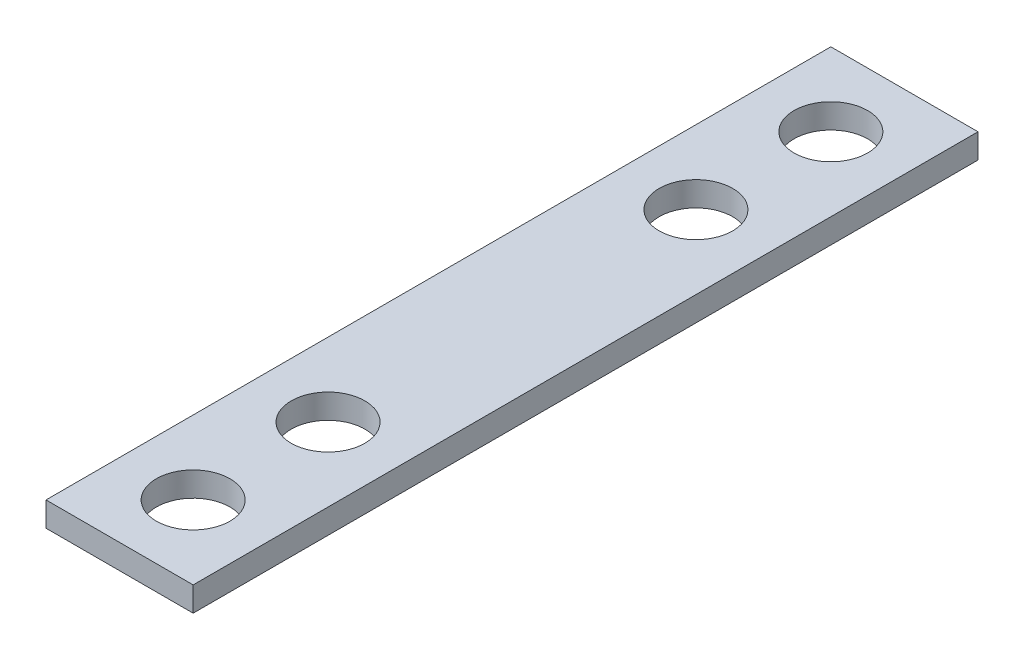
ISO-10303-21;
HEADER;
FILE_DESCRIPTION(('STEP AP214'),'2;1');
FILE_NAME('part.step','',(''),(''),'','','');
FILE_SCHEMA(('AUTOMOTIVE_DESIGN { 1 0 10303 214 1 1 1 1 }'));
ENDSEC;
DATA;
#1=APPLICATION_CONTEXT('core data for automotive mechanical design processes');
#2=APPLICATION_PROTOCOL_DEFINITION('international standard','automotive_design',2000,#1);
#3=PRODUCT_CONTEXT('',#1,'mechanical');
#4=PRODUCT('Part','Part','',(#3));
#5=PRODUCT_RELATED_PRODUCT_CATEGORY('part','',(#4));
#6=PRODUCT_DEFINITION_FORMATION('','',#4);
#7=PRODUCT_DEFINITION_CONTEXT('part definition',#1,'design');
#8=PRODUCT_DEFINITION('design','',#6,#7);
#9=PRODUCT_DEFINITION_SHAPE('','',#8);
#10=(LENGTH_UNIT() NAMED_UNIT(*) SI_UNIT(.MILLI.,.METRE.));
#11=(NAMED_UNIT(*) PLANE_ANGLE_UNIT() SI_UNIT($,.RADIAN.));
#12=(NAMED_UNIT(*) SI_UNIT($,.STERADIAN.) SOLID_ANGLE_UNIT());
#13=UNCERTAINTY_MEASURE_WITH_UNIT(LENGTH_MEASURE(1.E-05),#10,'distance_accuracy_value','');
#14=(GEOMETRIC_REPRESENTATION_CONTEXT(3) GLOBAL_UNCERTAINTY_ASSIGNED_CONTEXT((#13)) GLOBAL_UNIT_ASSIGNED_CONTEXT((#10,
#11,#12)) REPRESENTATION_CONTEXT('',''));
#15=CARTESIAN_POINT('',(0.,0.,0.));
#16=DIRECTION('',(0.,0.,1.));
#17=DIRECTION('',(1.,0.,0.));
#18=AXIS2_PLACEMENT_3D('',#15,#16,#17);
#19=CARTESIAN_POINT('',(-9.,1.,13.));
#20=DIRECTION('',(0.,-1.,0.));
#21=DIRECTION('',(0.,0.,-1.));
#22=AXIS2_PLACEMENT_3D('',#19,#20,#21);
#23=CYLINDRICAL_SURFACE('',#22,1.5);
#24=CARTESIAN_POINT('',(-9.,2.,13.));
#25=DIRECTION('',(0.,1.,0.));
#26=DIRECTION('',(0.,0.,1.));
#27=AXIS2_PLACEMENT_3D('',#24,#25,#26);
#28=CIRCLE('',#27,1.5);
#29=CARTESIAN_POINT('',(-9.,2.,14.5));
#30=VERTEX_POINT('',#29);
#31=EDGE_CURVE('E123',#30,#30,#28,.T.);
#32=ORIENTED_EDGE('',*,*,#31,.T.);
#33=EDGE_LOOP('',(#32));
#34=FACE_BOUND('',#33,.T.);
#35=CARTESIAN_POINT('',(-9.,1.,13.));
#36=DIRECTION('',(0.,-1.,0.));
#37=DIRECTION('',(0.,0.,-1.));
#38=AXIS2_PLACEMENT_3D('',#35,#36,#37);
#39=CIRCLE('',#38,1.5);
#40=CARTESIAN_POINT('',(-9.,1.,11.5));
#41=VERTEX_POINT('',#40);
#42=EDGE_CURVE('E144',#41,#41,#39,.T.);
#43=ORIENTED_EDGE('',*,*,#42,.T.);
#44=EDGE_LOOP('',(#43));
#45=FACE_BOUND('',#44,.T.);
#46=ADVANCED_FACE('F41',(#34,#45),#23,.F.);
#47=CARTESIAN_POINT('',(-9.,1.,-13.));
#48=DIRECTION('',(0.,-1.,0.));
#49=DIRECTION('',(0.,0.,-1.));
#50=AXIS2_PLACEMENT_3D('',#47,#48,#49);
#51=CYLINDRICAL_SURFACE('',#50,1.5);
#52=CARTESIAN_POINT('',(-9.,2.,-13.));
#53=DIRECTION('',(0.,1.,0.));
#54=DIRECTION('',(0.,0.,1.));
#55=AXIS2_PLACEMENT_3D('',#52,#53,#54);
#56=CIRCLE('',#55,1.5);
#57=CARTESIAN_POINT('',(-9.,2.,-11.5));
#58=VERTEX_POINT('',#57);
#59=EDGE_CURVE('E127',#58,#58,#56,.T.);
#60=ORIENTED_EDGE('',*,*,#59,.T.);
#61=EDGE_LOOP('',(#60));
#62=FACE_BOUND('',#61,.T.);
#63=CARTESIAN_POINT('',(-9.,1.,-13.));
#64=DIRECTION('',(0.,-1.,0.));
#65=DIRECTION('',(0.,0.,-1.));
#66=AXIS2_PLACEMENT_3D('',#63,#64,#65);
#67=CIRCLE('',#66,1.5);
#68=CARTESIAN_POINT('',(-9.,1.,-14.5));
#69=VERTEX_POINT('',#68);
#70=EDGE_CURVE('E151',#69,#69,#67,.T.);
#71=ORIENTED_EDGE('',*,*,#70,.T.);
#72=EDGE_LOOP('',(#71));
#73=FACE_BOUND('',#72,.T.);
#74=ADVANCED_FACE('F190',(#62,#73),#51,.F.);
#75=CARTESIAN_POINT('',(0.,1.,-16.));
#76=DIRECTION('',(0.,0.,-1.));
#77=DIRECTION('',(-1.,0.,0.));
#78=AXIS2_PLACEMENT_3D('',#75,#76,#77);
#79=PLANE('',#78);
#80=DIRECTION('',(0.,-1.,0.));
#81=VECTOR('',#80,1.);
#82=CARTESIAN_POINT('',(-5.99999999999999,2.,-16.));
#83=LINE('',#82,#81);
#84=CARTESIAN_POINT('',(-5.99999999999999,2.,-16.));
#85=VERTEX_POINT('',#84);
#86=CARTESIAN_POINT('',(-5.99999999999999,1.,-16.));
#87=VERTEX_POINT('',#86);
#88=EDGE_CURVE('E104',#85,#87,#83,.T.);
#89=ORIENTED_EDGE('',*,*,#88,.T.);
#90=DIRECTION('',(-1.,0.,0.));
#91=VECTOR('',#90,1.);
#92=CARTESIAN_POINT('',(0.,1.,-16.));
#93=LINE('',#92,#91);
#94=CARTESIAN_POINT('',(-12.,1.,-16.));
#95=VERTEX_POINT('',#94);
#96=EDGE_CURVE('E86',#87,#95,#93,.T.);
#97=ORIENTED_EDGE('',*,*,#96,.T.);
#98=DIRECTION('',(0.,-1.,0.));
#99=VECTOR('',#98,1.);
#100=CARTESIAN_POINT('',(-12.,2.,-16.));
#101=LINE('',#100,#99);
#102=CARTESIAN_POINT('',(-12.,2.,-16.));
#103=VERTEX_POINT('',#102);
#104=EDGE_CURVE('E107',#103,#95,#101,.T.);
#105=ORIENTED_EDGE('',*,*,#104,.F.);
#106=DIRECTION('',(-1.,0.,0.));
#107=VECTOR('',#106,1.);
#108=CARTESIAN_POINT('',(-12.,2.,-16.));
#109=LINE('',#108,#107);
#110=EDGE_CURVE('E60',#85,#103,#109,.T.);
#111=ORIENTED_EDGE('',*,*,#110,.F.);
#112=EDGE_LOOP('',(#89,#97,#105,#111));
#113=FACE_BOUND('',#112,.T.);
#114=ADVANCED_FACE('F157',(#113),#79,.T.);
#115=CARTESIAN_POINT('',(0.,1.,16.));
#116=DIRECTION('',(0.,0.,-1.));
#117=DIRECTION('',(-1.,0.,0.));
#118=AXIS2_PLACEMENT_3D('',#115,#116,#117);
#119=PLANE('',#118);
#120=DIRECTION('',(-1.,0.,0.));
#121=VECTOR('',#120,1.);
#122=CARTESIAN_POINT('',(0.,1.,16.));
#123=LINE('',#122,#121);
#124=CARTESIAN_POINT('',(-5.99999999999999,1.,16.));
#125=VERTEX_POINT('',#124);
#126=CARTESIAN_POINT('',(-12.,1.,16.));
#127=VERTEX_POINT('',#126);
#128=EDGE_CURVE('E84',#125,#127,#123,.T.);
#129=ORIENTED_EDGE('',*,*,#128,.F.);
#130=DIRECTION('',(0.,-1.,0.));
#131=VECTOR('',#130,1.);
#132=CARTESIAN_POINT('',(-5.99999999999999,2.,16.));
#133=LINE('',#132,#131);
#134=CARTESIAN_POINT('',(-5.99999999999999,2.,16.));
#135=VERTEX_POINT('',#134);
#136=EDGE_CURVE('E96',#135,#125,#133,.T.);
#137=ORIENTED_EDGE('',*,*,#136,.F.);
#138=DIRECTION('',(1.,0.,0.));
#139=VECTOR('',#138,1.);
#140=CARTESIAN_POINT('',(-12.,2.,16.));
#141=LINE('',#140,#139);
#142=CARTESIAN_POINT('',(-12.,2.,16.));
#143=VERTEX_POINT('',#142);
#144=EDGE_CURVE('E117',#143,#135,#141,.T.);
#145=ORIENTED_EDGE('',*,*,#144,.F.);
#146=DIRECTION('',(0.,-1.,0.));
#147=VECTOR('',#146,1.);
#148=CARTESIAN_POINT('',(-12.,2.,16.));
#149=LINE('',#148,#147);
#150=EDGE_CURVE('E45',#143,#127,#149,.T.);
#151=ORIENTED_EDGE('',*,*,#150,.T.);
#152=EDGE_LOOP('',(#129,#137,#145,#151));
#153=FACE_BOUND('',#152,.T.);
#154=ADVANCED_FACE('F43',(#153),#119,.F.);
#155=CARTESIAN_POINT('',(0.,1.,0.));
#156=DIRECTION('',(0.,1.,0.));
#157=DIRECTION('',(0.,0.,1.));
#158=AXIS2_PLACEMENT_3D('',#155,#156,#157);
#159=PLANE('',#158);
#160=CARTESIAN_POINT('',(-9.,1.,-7.5));
#161=DIRECTION('',(0.,1.,0.));
#162=DIRECTION('',(0.,0.,1.));
#163=AXIS2_PLACEMENT_3D('',#160,#161,#162);
#164=CIRCLE('',#163,1.5);
#165=CARTESIAN_POINT('',(-9.,1.,-6.));
#166=VERTEX_POINT('',#165);
#167=EDGE_CURVE('E140',#166,#166,#164,.T.);
#168=ORIENTED_EDGE('',*,*,#167,.T.);
#169=EDGE_LOOP('',(#168));
#170=FACE_BOUND('',#169,.T.);
#171=CARTESIAN_POINT('',(-9.,1.,7.5));
#172=DIRECTION('',(0.,1.,0.));
#173=DIRECTION('',(0.,0.,1.));
#174=AXIS2_PLACEMENT_3D('',#171,#172,#173);
#175=CIRCLE('',#174,1.5);
#176=CARTESIAN_POINT('',(-9.,1.,9.));
#177=VERTEX_POINT('',#176);
#178=EDGE_CURVE('E132',#177,#177,#175,.T.);
#179=ORIENTED_EDGE('',*,*,#178,.T.);
#180=EDGE_LOOP('',(#179));
#181=FACE_BOUND('',#180,.T.);
#182=DIRECTION('',(0.,0.,1.));
#183=VECTOR('',#182,1.);
#184=CARTESIAN_POINT('',(-12.,1.,-16.));
#185=LINE('',#184,#183);
#186=EDGE_CURVE('E11',#95,#127,#185,.T.);
#187=ORIENTED_EDGE('',*,*,#186,.F.);
#188=ORIENTED_EDGE('',*,*,#96,.F.);
#189=DIRECTION('',(0.,0.,-1.));
#190=VECTOR('',#189,1.);
#191=CARTESIAN_POINT('',(-5.99999999999999,1.,16.));
#192=LINE('',#191,#190);
#193=EDGE_CURVE('E52',#125,#87,#192,.T.);
#194=ORIENTED_EDGE('',*,*,#193,.F.);
#195=ORIENTED_EDGE('',*,*,#128,.T.);
#196=EDGE_LOOP('',(#187,#188,#194,#195));
#197=FACE_BOUND('',#196,.T.);
#198=ORIENTED_EDGE('',*,*,#42,.F.);
#199=EDGE_LOOP('',(#198));
#200=FACE_BOUND('',#199,.T.);
#201=ORIENTED_EDGE('',*,*,#70,.F.);
#202=EDGE_LOOP('',(#201));
#203=FACE_BOUND('',#202,.T.);
#204=ADVANCED_FACE('F82',(#170,#181,#197,#200,#203),#159,.F.);
#205=CARTESIAN_POINT('',(0.,2.,0.));
#206=DIRECTION('',(0.,1.,0.));
#207=DIRECTION('',(0.,0.,1.));
#208=AXIS2_PLACEMENT_3D('',#205,#206,#207);
#209=PLANE('',#208);
#210=CARTESIAN_POINT('',(-9.,2.,7.5));
#211=DIRECTION('',(0.,1.,0.));
#212=DIRECTION('',(0.,0.,1.));
#213=AXIS2_PLACEMENT_3D('',#210,#211,#212);
#214=CIRCLE('',#213,1.5);
#215=CARTESIAN_POINT('',(-9.,2.,9.));
#216=VERTEX_POINT('',#215);
#217=EDGE_CURVE('E131',#216,#216,#214,.T.);
#218=ORIENTED_EDGE('',*,*,#217,.F.);
#219=EDGE_LOOP('',(#218));
#220=FACE_BOUND('',#219,.T.);
#221=ORIENTED_EDGE('',*,*,#31,.F.);
#222=EDGE_LOOP('',(#221));
#223=FACE_BOUND('',#222,.T.);
#224=DIRECTION('',(0.,0.,1.));
#225=VECTOR('',#224,1.);
#226=CARTESIAN_POINT('',(-12.,2.,-16.));
#227=LINE('',#226,#225);
#228=EDGE_CURVE('E120',#103,#143,#227,.T.);
#229=ORIENTED_EDGE('',*,*,#228,.T.);
#230=ORIENTED_EDGE('',*,*,#144,.T.);
#231=DIRECTION('',(0.,0.,-1.));
#232=VECTOR('',#231,1.);
#233=CARTESIAN_POINT('',(-5.99999999999999,2.,16.));
#234=LINE('',#233,#232);
#235=EDGE_CURVE('E102',#135,#85,#234,.T.);
#236=ORIENTED_EDGE('',*,*,#235,.T.);
#237=ORIENTED_EDGE('',*,*,#110,.T.);
#238=EDGE_LOOP('',(#229,#230,#236,#237));
#239=FACE_BOUND('',#238,.T.);
#240=ORIENTED_EDGE('',*,*,#59,.F.);
#241=EDGE_LOOP('',(#240));
#242=FACE_BOUND('',#241,.T.);
#243=CARTESIAN_POINT('',(-9.,2.,-7.5));
#244=DIRECTION('',(0.,1.,0.));
#245=DIRECTION('',(0.,0.,1.));
#246=AXIS2_PLACEMENT_3D('',#243,#244,#245);
#247=CIRCLE('',#246,1.5);
#248=CARTESIAN_POINT('',(-9.,2.,-6.));
#249=VERTEX_POINT('',#248);
#250=EDGE_CURVE('E136',#249,#249,#247,.T.);
#251=ORIENTED_EDGE('',*,*,#250,.F.);
#252=EDGE_LOOP('',(#251));
#253=FACE_BOUND('',#252,.T.);
#254=ADVANCED_FACE('F161',(#220,#223,#239,#242,#253),#209,.T.);
#255=CARTESIAN_POINT('',(-12.,2.,-16.));
#256=DIRECTION('',(1.,0.,0.));
#257=DIRECTION('',(0.,0.,-1.));
#258=AXIS2_PLACEMENT_3D('',#255,#256,#257);
#259=PLANE('',#258);
#260=ORIENTED_EDGE('',*,*,#104,.T.);
#261=ORIENTED_EDGE('',*,*,#186,.T.);
#262=ORIENTED_EDGE('',*,*,#150,.F.);
#263=ORIENTED_EDGE('',*,*,#228,.F.);
#264=EDGE_LOOP('',(#260,#261,#262,#263));
#265=FACE_BOUND('',#264,.T.);
#266=ADVANCED_FACE('F160',(#265),#259,.F.);
#267=CARTESIAN_POINT('',(-5.99999999999999,2.,16.));
#268=DIRECTION('',(-1.,0.,0.));
#269=DIRECTION('',(0.,0.,1.));
#270=AXIS2_PLACEMENT_3D('',#267,#268,#269);
#271=PLANE('',#270);
#272=ORIENTED_EDGE('',*,*,#136,.T.);
#273=ORIENTED_EDGE('',*,*,#193,.T.);
#274=ORIENTED_EDGE('',*,*,#88,.F.);
#275=ORIENTED_EDGE('',*,*,#235,.F.);
#276=EDGE_LOOP('',(#272,#273,#274,#275));
#277=FACE_BOUND('',#276,.T.);
#278=ADVANCED_FACE('F101',(#277),#271,.F.);
#279=CARTESIAN_POINT('',(-9.,2.,7.5));
#280=DIRECTION('',(0.,-1.,0.));
#281=DIRECTION('',(0.,0.,-1.));
#282=AXIS2_PLACEMENT_3D('',#279,#280,#281);
#283=CYLINDRICAL_SURFACE('',#282,1.5);
#284=ORIENTED_EDGE('',*,*,#217,.T.);
#285=EDGE_LOOP('',(#284));
#286=FACE_BOUND('',#285,.T.);
#287=ORIENTED_EDGE('',*,*,#178,.F.);
#288=EDGE_LOOP('',(#287));
#289=FACE_BOUND('',#288,.T.);
#290=ADVANCED_FACE('F173',(#286,#289),#283,.F.);
#291=CARTESIAN_POINT('',(-9.,2.,-7.5));
#292=DIRECTION('',(0.,-1.,0.));
#293=DIRECTION('',(0.,0.,-1.));
#294=AXIS2_PLACEMENT_3D('',#291,#292,#293);
#295=CYLINDRICAL_SURFACE('',#294,1.5);
#296=ORIENTED_EDGE('',*,*,#250,.T.);
#297=EDGE_LOOP('',(#296));
#298=FACE_BOUND('',#297,.T.);
#299=ORIENTED_EDGE('',*,*,#167,.F.);
#300=EDGE_LOOP('',(#299));
#301=FACE_BOUND('',#300,.T.);
#302=ADVANCED_FACE('F170',(#298,#301),#295,.F.);
#303=CLOSED_SHELL('',(#46,#74,#114,#154,#204,#254,#266,#278,#290,#302));
#304=MANIFOLD_SOLID_BREP('B2',#303);
#305=ADVANCED_BREP_SHAPE_REPRESENTATION('',(#18,#304),#14);
#306=SHAPE_DEFINITION_REPRESENTATION(#9,#305);
ENDSEC;
END-ISO-10303-21;
